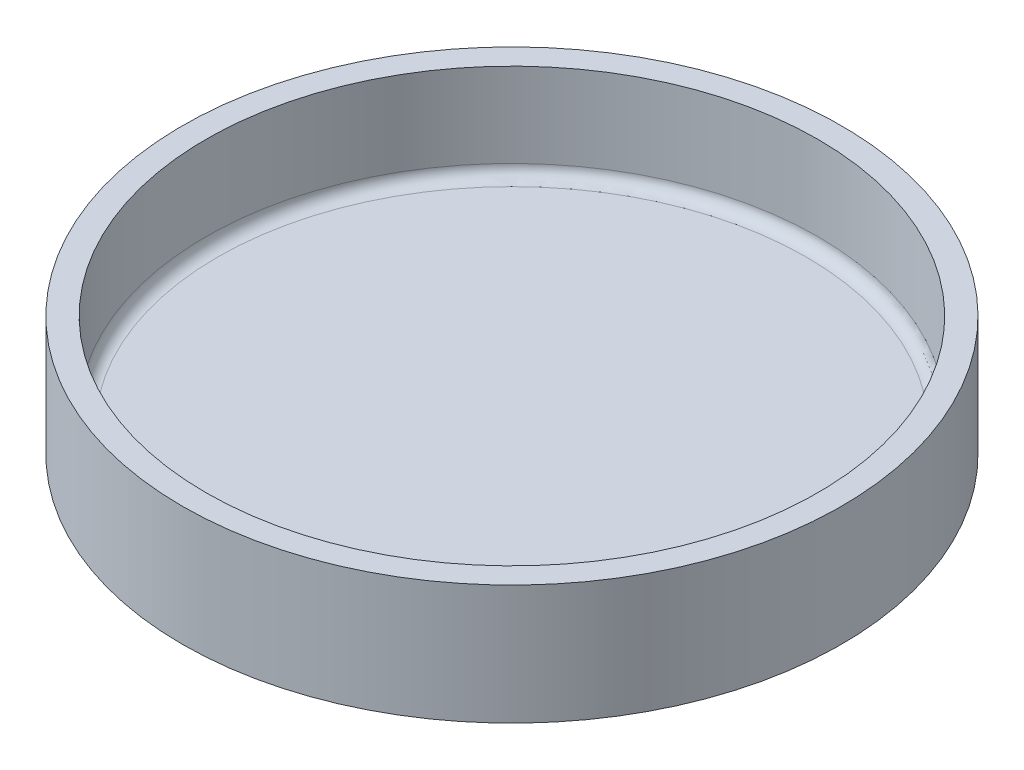
ISO-10303-21;
HEADER;
FILE_DESCRIPTION(('STEP AP214'),'2;1');
FILE_NAME('part.step','',(''),(''),'','','');
FILE_SCHEMA(('AUTOMOTIVE_DESIGN { 1 0 10303 214 1 1 1 1 }'));
ENDSEC;
DATA;
#1=APPLICATION_CONTEXT('core data for automotive mechanical design processes');
#2=APPLICATION_PROTOCOL_DEFINITION('international standard','automotive_design',2000,#1);
#3=PRODUCT_CONTEXT('',#1,'mechanical');
#4=PRODUCT('Part','Part','',(#3));
#5=PRODUCT_RELATED_PRODUCT_CATEGORY('part','',(#4));
#6=PRODUCT_DEFINITION_FORMATION('','',#4);
#7=PRODUCT_DEFINITION_CONTEXT('part definition',#1,'design');
#8=PRODUCT_DEFINITION('design','',#6,#7);
#9=PRODUCT_DEFINITION_SHAPE('','',#8);
#10=(LENGTH_UNIT() NAMED_UNIT(*) SI_UNIT(.MILLI.,.METRE.));
#11=(NAMED_UNIT(*) PLANE_ANGLE_UNIT() SI_UNIT($,.RADIAN.));
#12=(NAMED_UNIT(*) SI_UNIT($,.STERADIAN.) SOLID_ANGLE_UNIT());
#13=UNCERTAINTY_MEASURE_WITH_UNIT(LENGTH_MEASURE(1.E-05),#10,'distance_accuracy_value','');
#14=(GEOMETRIC_REPRESENTATION_CONTEXT(3) GLOBAL_UNCERTAINTY_ASSIGNED_CONTEXT((#13)) GLOBAL_UNIT_ASSIGNED_CONTEXT((#10,
#11,#12)) REPRESENTATION_CONTEXT('',''));
#15=CARTESIAN_POINT('',(0.,0.,0.));
#16=DIRECTION('',(0.,0.,1.));
#17=DIRECTION('',(1.,0.,0.));
#18=AXIS2_PLACEMENT_3D('',#15,#16,#17);
#19=CARTESIAN_POINT('',(0.,5.,0.));
#20=DIRECTION('',(0.,-1.,0.));
#21=DIRECTION('',(0.,0.,-1.));
#22=AXIS2_PLACEMENT_3D('',#19,#20,#21);
#23=CYLINDRICAL_SURFACE('',#22,70.);
#24=CARTESIAN_POINT('',(0.,0.,0.));
#25=DIRECTION('',(0.,1.,0.));
#26=DIRECTION('',(0.,0.,1.));
#27=AXIS2_PLACEMENT_3D('',#24,#25,#26);
#28=CIRCLE('',#27,70.);
#29=CARTESIAN_POINT('',(0.,0.,70.));
#30=VERTEX_POINT('',#29);
#31=EDGE_CURVE('E52',#30,#30,#28,.T.);
#32=ORIENTED_EDGE('',*,*,#31,.T.);
#33=EDGE_LOOP('',(#32));
#34=FACE_BOUND('',#33,.T.);
#35=CARTESIAN_POINT('',(0.,25.4,0.));
#36=DIRECTION('',(0.,1.,0.));
#37=DIRECTION('',(0.,0.,1.));
#38=AXIS2_PLACEMENT_3D('',#35,#36,#37);
#39=CIRCLE('',#38,70.);
#40=CARTESIAN_POINT('',(0.,25.4,70.));
#41=VERTEX_POINT('',#40);
#42=EDGE_CURVE('E57',#41,#41,#39,.T.);
#43=ORIENTED_EDGE('',*,*,#42,.F.);
#44=EDGE_LOOP('',(#43));
#45=FACE_BOUND('',#44,.T.);
#46=ADVANCED_FACE('F39',(#34,#45),#23,.T.);
#47=CARTESIAN_POINT('',(0.,0.,0.));
#48=DIRECTION('',(0.,1.,0.));
#49=DIRECTION('',(0.,0.,1.));
#50=AXIS2_PLACEMENT_3D('',#47,#48,#49);
#51=PLANE('',#50);
#52=ORIENTED_EDGE('',*,*,#31,.F.);
#53=EDGE_LOOP('',(#52));
#54=FACE_BOUND('',#53,.T.);
#55=ADVANCED_FACE('F78',(#54),#51,.F.);
#56=CARTESIAN_POINT('',(0.,25.4,0.));
#57=DIRECTION('',(0.,-1.,0.));
#58=DIRECTION('',(0.,0.,-1.));
#59=AXIS2_PLACEMENT_3D('',#56,#57,#58);
#60=CYLINDRICAL_SURFACE('',#59,65.);
#61=CARTESIAN_POINT('',(0.,7.5,0.));
#62=DIRECTION('',(0.,1.,0.));
#63=DIRECTION('',(0.,0.,1.));
#64=AXIS2_PLACEMENT_3D('',#61,#62,#63);
#65=CIRCLE('',#64,65.);
#66=CARTESIAN_POINT('',(0.,7.5,65.));
#67=VERTEX_POINT('',#66);
#68=EDGE_CURVE('E47',#67,#67,#65,.F.);
#69=ORIENTED_EDGE('',*,*,#68,.T.);
#70=EDGE_LOOP('',(#69));
#71=FACE_BOUND('',#70,.T.);
#72=CARTESIAN_POINT('',(0.,25.4,0.));
#73=DIRECTION('',(0.,1.,0.));
#74=DIRECTION('',(0.,0.,1.));
#75=AXIS2_PLACEMENT_3D('',#72,#73,#74);
#76=CIRCLE('',#75,65.);
#77=CARTESIAN_POINT('',(0.,25.4,65.));
#78=VERTEX_POINT('',#77);
#79=EDGE_CURVE('E63',#78,#78,#76,.T.);
#80=ORIENTED_EDGE('',*,*,#79,.T.);
#81=EDGE_LOOP('',(#80));
#82=FACE_BOUND('',#81,.T.);
#83=ADVANCED_FACE('F68',(#71,#82),#60,.F.);
#84=CARTESIAN_POINT('',(0.,25.4,0.));
#85=DIRECTION('',(0.,1.,0.));
#86=DIRECTION('',(0.,0.,1.));
#87=AXIS2_PLACEMENT_3D('',#84,#85,#86);
#88=PLANE('',#87);
#89=ORIENTED_EDGE('',*,*,#79,.F.);
#90=EDGE_LOOP('',(#89));
#91=FACE_BOUND('',#90,.T.);
#92=ORIENTED_EDGE('',*,*,#42,.T.);
#93=EDGE_LOOP('',(#92));
#94=FACE_BOUND('',#93,.T.);
#95=ADVANCED_FACE('F70',(#91,#94),#88,.T.);
#96=CARTESIAN_POINT('',(0.,5.,0.));
#97=DIRECTION('',(0.,1.,0.));
#98=DIRECTION('',(0.,0.,1.));
#99=AXIS2_PLACEMENT_3D('',#96,#97,#98);
#100=PLANE('',#99);
#101=CARTESIAN_POINT('',(0.,5.,0.));
#102=DIRECTION('',(0.,1.,0.));
#103=DIRECTION('',(0.,0.,1.));
#104=AXIS2_PLACEMENT_3D('',#101,#102,#103);
#105=CIRCLE('',#104,62.5);
#106=CARTESIAN_POINT('',(0.,5.,62.5));
#107=VERTEX_POINT('',#106);
#108=EDGE_CURVE('E10',#107,#107,#105,.T.);
#109=ORIENTED_EDGE('',*,*,#108,.T.);
#110=EDGE_LOOP('',(#109));
#111=FACE_BOUND('',#110,.T.);
#112=ADVANCED_FACE('F73',(#111),#100,.T.);
#113=CARTESIAN_POINT('',(0.,7.5,0.));
#114=DIRECTION('',(0.,1.,0.));
#115=DIRECTION('',(0.,0.,1.));
#116=AXIS2_PLACEMENT_3D('',#113,#114,#115);
#117=TOROIDAL_SURFACE('',#116,62.5,2.5);
#118=ORIENTED_EDGE('',*,*,#108,.F.);
#119=EDGE_LOOP('',(#118));
#120=FACE_BOUND('',#119,.T.);
#121=ORIENTED_EDGE('',*,*,#68,.F.);
#122=EDGE_LOOP('',(#121));
#123=FACE_BOUND('',#122,.T.);
#124=ADVANCED_FACE('F41',(#120,#123),#117,.F.);
#125=CLOSED_SHELL('',(#46,#55,#83,#95,#112,#124));
#126=MANIFOLD_SOLID_BREP('B2',#125);
#127=ADVANCED_BREP_SHAPE_REPRESENTATION('',(#18,#126),#14);
#128=SHAPE_DEFINITION_REPRESENTATION(#9,#127);
ENDSEC;
END-ISO-10303-21;
